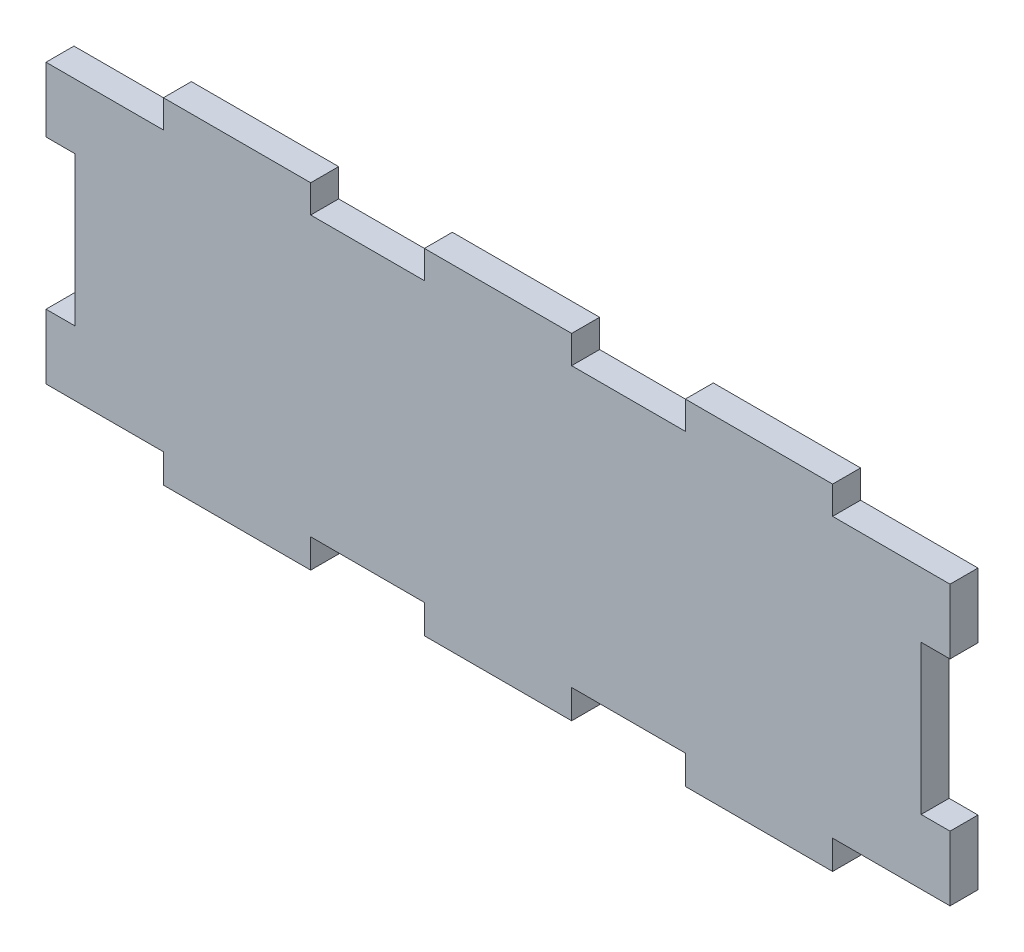
ISO-10303-21;
HEADER;
FILE_DESCRIPTION(('STEP AP214'),'2;1');
FILE_NAME('part.step','',(''),(''),'','','');
FILE_SCHEMA(('AUTOMOTIVE_DESIGN { 1 0 10303 214 1 1 1 1 }'));
ENDSEC;
DATA;
#1=APPLICATION_CONTEXT('core data for automotive mechanical design processes');
#2=APPLICATION_PROTOCOL_DEFINITION('international standard','automotive_design',2000,#1);
#3=PRODUCT_CONTEXT('',#1,'mechanical');
#4=PRODUCT('Part','Part','',(#3));
#5=PRODUCT_RELATED_PRODUCT_CATEGORY('part','',(#4));
#6=PRODUCT_DEFINITION_FORMATION('','',#4);
#7=PRODUCT_DEFINITION_CONTEXT('part definition',#1,'design');
#8=PRODUCT_DEFINITION('design','',#6,#7);
#9=PRODUCT_DEFINITION_SHAPE('','',#8);
#10=(LENGTH_UNIT() NAMED_UNIT(*) SI_UNIT(.MILLI.,.METRE.));
#11=(NAMED_UNIT(*) PLANE_ANGLE_UNIT() SI_UNIT($,.RADIAN.));
#12=(NAMED_UNIT(*) SI_UNIT($,.STERADIAN.) SOLID_ANGLE_UNIT());
#13=UNCERTAINTY_MEASURE_WITH_UNIT(LENGTH_MEASURE(1.E-05),#10,'distance_accuracy_value','');
#14=(GEOMETRIC_REPRESENTATION_CONTEXT(3) GLOBAL_UNCERTAINTY_ASSIGNED_CONTEXT((#13)) GLOBAL_UNIT_ASSIGNED_CONTEXT((#10,
#11,#12)) REPRESENTATION_CONTEXT('',''));
#15=CARTESIAN_POINT('',(0.,0.,0.));
#16=DIRECTION('',(0.,0.,1.));
#17=DIRECTION('',(1.,0.,0.));
#18=AXIS2_PLACEMENT_3D('',#15,#16,#17);
#19=CARTESIAN_POINT('',(0.,22.95,3.));
#20=DIRECTION('',(0.,-1.,0.));
#21=DIRECTION('',(0.,0.,-1.));
#22=AXIS2_PLACEMENT_3D('',#19,#20,#21);
#23=PLANE('',#22);
#24=DIRECTION('',(-1.,0.,0.));
#25=VECTOR('',#24,1.);
#26=CARTESIAN_POINT('',(0.,22.95,0.));
#27=LINE('',#26,#25);
#28=CARTESIAN_POINT('',(97.,22.95,0.));
#29=VERTEX_POINT('',#28);
#30=CARTESIAN_POINT('',(93.9,22.95,0.));
#31=VERTEX_POINT('',#30);
#32=EDGE_CURVE('E296',#29,#31,#27,.T.);
#33=ORIENTED_EDGE('',*,*,#32,.F.);
#34=DIRECTION('',(0.,0.,-1.));
#35=VECTOR('',#34,1.);
#36=CARTESIAN_POINT('',(97.,22.95,3.));
#37=LINE('',#36,#35);
#38=CARTESIAN_POINT('',(97.,22.95,3.));
#39=VERTEX_POINT('',#38);
#40=EDGE_CURVE('E11',#39,#29,#37,.T.);
#41=ORIENTED_EDGE('',*,*,#40,.F.);
#42=DIRECTION('',(-1.,0.,0.));
#43=VECTOR('',#42,1.);
#44=CARTESIAN_POINT('',(0.,22.95,3.));
#45=LINE('',#44,#43);
#46=CARTESIAN_POINT('',(93.9,22.95,3.));
#47=VERTEX_POINT('',#46);
#48=EDGE_CURVE('E385',#39,#47,#45,.T.);
#49=ORIENTED_EDGE('',*,*,#48,.T.);
#50=DIRECTION('',(0.,0.,-1.));
#51=VECTOR('',#50,1.);
#52=CARTESIAN_POINT('',(93.9,22.95,3.));
#53=LINE('',#52,#51);
#54=EDGE_CURVE('E50',#47,#31,#53,.T.);
#55=ORIENTED_EDGE('',*,*,#54,.T.);
#56=EDGE_LOOP('',(#33,#41,#49,#55));
#57=FACE_BOUND('',#56,.T.);
#58=ADVANCED_FACE('F34',(#57),#23,.T.);
#59=CARTESIAN_POINT('',(97.,0.,3.));
#60=DIRECTION('',(-1.,0.,0.));
#61=DIRECTION('',(0.,0.,1.));
#62=AXIS2_PLACEMENT_3D('',#59,#60,#61);
#63=PLANE('',#62);
#64=DIRECTION('',(0.,1.,0.));
#65=VECTOR('',#64,1.);
#66=CARTESIAN_POINT('',(97.,0.,0.));
#67=LINE('',#66,#65);
#68=CARTESIAN_POINT('',(97.,29.9,0.));
#69=VERTEX_POINT('',#68);
#70=EDGE_CURVE('E298',#29,#69,#67,.T.);
#71=ORIENTED_EDGE('',*,*,#70,.T.);
#72=DIRECTION('',(0.,0.,-1.));
#73=VECTOR('',#72,1.);
#74=CARTESIAN_POINT('',(97.,29.9,3.));
#75=LINE('',#74,#73);
#76=CARTESIAN_POINT('',(97.,29.9,3.));
#77=VERTEX_POINT('',#76);
#78=EDGE_CURVE('E42',#77,#69,#75,.T.);
#79=ORIENTED_EDGE('',*,*,#78,.F.);
#80=DIRECTION('',(0.,1.,0.));
#81=VECTOR('',#80,1.);
#82=CARTESIAN_POINT('',(97.,0.,3.));
#83=LINE('',#82,#81);
#84=EDGE_CURVE('E483',#39,#77,#83,.T.);
#85=ORIENTED_EDGE('',*,*,#84,.F.);
#86=ORIENTED_EDGE('',*,*,#40,.T.);
#87=EDGE_LOOP('',(#71,#79,#85,#86));
#88=FACE_BOUND('',#87,.T.);
#89=ADVANCED_FACE('F471',(#88),#63,.F.);
#90=CARTESIAN_POINT('',(0.,29.9,3.));
#91=DIRECTION('',(0.,1.,0.));
#92=DIRECTION('',(0.,0.,1.));
#93=AXIS2_PLACEMENT_3D('',#90,#91,#92);
#94=PLANE('',#93);
#95=DIRECTION('',(1.,0.,0.));
#96=VECTOR('',#95,1.);
#97=CARTESIAN_POINT('',(0.,29.9,0.));
#98=LINE('',#97,#96);
#99=CARTESIAN_POINT('',(84.4,29.9,0.));
#100=VERTEX_POINT('',#99);
#101=EDGE_CURVE('E301',#100,#69,#98,.T.);
#102=ORIENTED_EDGE('',*,*,#101,.F.);
#103=DIRECTION('',(0.,0.,-1.));
#104=VECTOR('',#103,1.);
#105=CARTESIAN_POINT('',(84.4,29.9,3.));
#106=LINE('',#105,#104);
#107=CARTESIAN_POINT('',(84.4,29.9,3.));
#108=VERTEX_POINT('',#107);
#109=EDGE_CURVE('E461',#108,#100,#106,.T.);
#110=ORIENTED_EDGE('',*,*,#109,.F.);
#111=DIRECTION('',(1.,0.,0.));
#112=VECTOR('',#111,1.);
#113=CARTESIAN_POINT('',(0.,29.9,3.));
#114=LINE('',#113,#112);
#115=EDGE_CURVE('E468',#108,#77,#114,.T.);
#116=ORIENTED_EDGE('',*,*,#115,.T.);
#117=ORIENTED_EDGE('',*,*,#78,.T.);
#118=EDGE_LOOP('',(#102,#110,#116,#117));
#119=FACE_BOUND('',#118,.T.);
#120=ADVANCED_FACE('F466',(#119),#94,.T.);
#121=CARTESIAN_POINT('',(84.4,0.,3.));
#122=DIRECTION('',(1.,0.,0.));
#123=DIRECTION('',(0.,0.,-1.));
#124=AXIS2_PLACEMENT_3D('',#121,#122,#123);
#125=PLANE('',#124);
#126=DIRECTION('',(0.,-1.,0.));
#127=VECTOR('',#126,1.);
#128=CARTESIAN_POINT('',(84.4,0.,0.));
#129=LINE('',#128,#127);
#130=CARTESIAN_POINT('',(84.4,32.9,0.));
#131=VERTEX_POINT('',#130);
#132=EDGE_CURVE('E304',#131,#100,#129,.T.);
#133=ORIENTED_EDGE('',*,*,#132,.F.);
#134=DIRECTION('',(0.,0.,-1.));
#135=VECTOR('',#134,1.);
#136=CARTESIAN_POINT('',(84.4,32.9,3.));
#137=LINE('',#136,#135);
#138=CARTESIAN_POINT('',(84.4,32.9,3.));
#139=VERTEX_POINT('',#138);
#140=EDGE_CURVE('E459',#139,#131,#137,.T.);
#141=ORIENTED_EDGE('',*,*,#140,.F.);
#142=DIRECTION('',(0.,-1.,0.));
#143=VECTOR('',#142,1.);
#144=CARTESIAN_POINT('',(84.4,0.,3.));
#145=LINE('',#144,#143);
#146=EDGE_CURVE('E480',#139,#108,#145,.T.);
#147=ORIENTED_EDGE('',*,*,#146,.T.);
#148=ORIENTED_EDGE('',*,*,#109,.T.);
#149=EDGE_LOOP('',(#133,#141,#147,#148));
#150=FACE_BOUND('',#149,.T.);
#151=ADVANCED_FACE('F477',(#150),#125,.T.);
#152=CARTESIAN_POINT('',(0.,32.9,3.));
#153=DIRECTION('',(0.,1.,0.));
#154=DIRECTION('',(0.,0.,1.));
#155=AXIS2_PLACEMENT_3D('',#152,#153,#154);
#156=PLANE('',#155);
#157=DIRECTION('',(1.,0.,0.));
#158=VECTOR('',#157,1.);
#159=CARTESIAN_POINT('',(0.,32.9,0.));
#160=LINE('',#159,#158);
#161=CARTESIAN_POINT('',(68.6,32.9,0.));
#162=VERTEX_POINT('',#161);
#163=EDGE_CURVE('E307',#162,#131,#160,.T.);
#164=ORIENTED_EDGE('',*,*,#163,.F.);
#165=DIRECTION('',(0.,0.,-1.));
#166=VECTOR('',#165,1.);
#167=CARTESIAN_POINT('',(68.6,32.9,3.));
#168=LINE('',#167,#166);
#169=CARTESIAN_POINT('',(68.6,32.9,3.));
#170=VERTEX_POINT('',#169);
#171=EDGE_CURVE('E457',#170,#162,#168,.T.);
#172=ORIENTED_EDGE('',*,*,#171,.F.);
#173=DIRECTION('',(1.,0.,0.));
#174=VECTOR('',#173,1.);
#175=CARTESIAN_POINT('',(0.,32.9,3.));
#176=LINE('',#175,#174);
#177=EDGE_CURVE('E485',#170,#139,#176,.T.);
#178=ORIENTED_EDGE('',*,*,#177,.T.);
#179=ORIENTED_EDGE('',*,*,#140,.T.);
#180=EDGE_LOOP('',(#164,#172,#178,#179));
#181=FACE_BOUND('',#180,.T.);
#182=ADVANCED_FACE('F587',(#181),#156,.T.);
#183=CARTESIAN_POINT('',(68.6,0.,3.));
#184=DIRECTION('',(-1.,0.,0.));
#185=DIRECTION('',(0.,0.,1.));
#186=AXIS2_PLACEMENT_3D('',#183,#184,#185);
#187=PLANE('',#186);
#188=DIRECTION('',(0.,1.,0.));
#189=VECTOR('',#188,1.);
#190=CARTESIAN_POINT('',(68.6,0.,0.));
#191=LINE('',#190,#189);
#192=CARTESIAN_POINT('',(68.6,29.9,0.));
#193=VERTEX_POINT('',#192);
#194=EDGE_CURVE('E310',#193,#162,#191,.T.);
#195=ORIENTED_EDGE('',*,*,#194,.F.);
#196=DIRECTION('',(0.,0.,-1.));
#197=VECTOR('',#196,1.);
#198=CARTESIAN_POINT('',(68.6,29.9,3.));
#199=LINE('',#198,#197);
#200=CARTESIAN_POINT('',(68.6,29.9,3.));
#201=VERTEX_POINT('',#200);
#202=EDGE_CURVE('E455',#201,#193,#199,.T.);
#203=ORIENTED_EDGE('',*,*,#202,.F.);
#204=DIRECTION('',(0.,1.,0.));
#205=VECTOR('',#204,1.);
#206=CARTESIAN_POINT('',(68.6,0.,3.));
#207=LINE('',#206,#205);
#208=EDGE_CURVE('E491',#201,#170,#207,.T.);
#209=ORIENTED_EDGE('',*,*,#208,.T.);
#210=ORIENTED_EDGE('',*,*,#171,.T.);
#211=EDGE_LOOP('',(#195,#203,#209,#210));
#212=FACE_BOUND('',#211,.T.);
#213=ADVANCED_FACE('F590',(#212),#187,.T.);
#214=CARTESIAN_POINT('',(0.,29.9,3.));
#215=DIRECTION('',(0.,1.,0.));
#216=DIRECTION('',(0.,0.,1.));
#217=AXIS2_PLACEMENT_3D('',#214,#215,#216);
#218=PLANE('',#217);
#219=DIRECTION('',(1.,0.,0.));
#220=VECTOR('',#219,1.);
#221=CARTESIAN_POINT('',(0.,29.9,0.));
#222=LINE('',#221,#220);
#223=CARTESIAN_POINT('',(56.4,29.9,0.));
#224=VERTEX_POINT('',#223);
#225=EDGE_CURVE('E313',#224,#193,#222,.T.);
#226=ORIENTED_EDGE('',*,*,#225,.F.);
#227=DIRECTION('',(0.,0.,-1.));
#228=VECTOR('',#227,1.);
#229=CARTESIAN_POINT('',(56.4,29.9,3.));
#230=LINE('',#229,#228);
#231=CARTESIAN_POINT('',(56.4,29.9,3.));
#232=VERTEX_POINT('',#231);
#233=EDGE_CURVE('E453',#232,#224,#230,.T.);
#234=ORIENTED_EDGE('',*,*,#233,.F.);
#235=DIRECTION('',(1.,0.,0.));
#236=VECTOR('',#235,1.);
#237=CARTESIAN_POINT('',(0.,29.9,3.));
#238=LINE('',#237,#236);
#239=EDGE_CURVE('E494',#232,#201,#238,.T.);
#240=ORIENTED_EDGE('',*,*,#239,.T.);
#241=ORIENTED_EDGE('',*,*,#202,.T.);
#242=EDGE_LOOP('',(#226,#234,#240,#241));
#243=FACE_BOUND('',#242,.T.);
#244=ADVANCED_FACE('F594',(#243),#218,.T.);
#245=CARTESIAN_POINT('',(56.4,0.,3.));
#246=DIRECTION('',(1.,0.,0.));
#247=DIRECTION('',(0.,0.,-1.));
#248=AXIS2_PLACEMENT_3D('',#245,#246,#247);
#249=PLANE('',#248);
#250=DIRECTION('',(0.,-1.,0.));
#251=VECTOR('',#250,1.);
#252=CARTESIAN_POINT('',(56.4,0.,0.));
#253=LINE('',#252,#251);
#254=CARTESIAN_POINT('',(56.4,32.9,0.));
#255=VERTEX_POINT('',#254);
#256=EDGE_CURVE('E316',#255,#224,#253,.T.);
#257=ORIENTED_EDGE('',*,*,#256,.F.);
#258=DIRECTION('',(0.,0.,-1.));
#259=VECTOR('',#258,1.);
#260=CARTESIAN_POINT('',(56.4,32.9,3.));
#261=LINE('',#260,#259);
#262=CARTESIAN_POINT('',(56.4,32.9,3.));
#263=VERTEX_POINT('',#262);
#264=EDGE_CURVE('E451',#263,#255,#261,.T.);
#265=ORIENTED_EDGE('',*,*,#264,.F.);
#266=DIRECTION('',(0.,-1.,0.));
#267=VECTOR('',#266,1.);
#268=CARTESIAN_POINT('',(56.4,0.,3.));
#269=LINE('',#268,#267);
#270=EDGE_CURVE('E497',#263,#232,#269,.T.);
#271=ORIENTED_EDGE('',*,*,#270,.T.);
#272=ORIENTED_EDGE('',*,*,#233,.T.);
#273=EDGE_LOOP('',(#257,#265,#271,#272));
#274=FACE_BOUND('',#273,.T.);
#275=ADVANCED_FACE('F598',(#274),#249,.T.);
#276=CARTESIAN_POINT('',(0.,32.9,3.));
#277=DIRECTION('',(0.,1.,0.));
#278=DIRECTION('',(0.,0.,1.));
#279=AXIS2_PLACEMENT_3D('',#276,#277,#278);
#280=PLANE('',#279);
#281=DIRECTION('',(1.,0.,0.));
#282=VECTOR('',#281,1.);
#283=CARTESIAN_POINT('',(0.,32.9,0.));
#284=LINE('',#283,#282);
#285=CARTESIAN_POINT('',(40.6,32.9,0.));
#286=VERTEX_POINT('',#285);
#287=EDGE_CURVE('E319',#286,#255,#284,.T.);
#288=ORIENTED_EDGE('',*,*,#287,.F.);
#289=DIRECTION('',(0.,0.,-1.));
#290=VECTOR('',#289,1.);
#291=CARTESIAN_POINT('',(40.6,32.9,3.));
#292=LINE('',#291,#290);
#293=CARTESIAN_POINT('',(40.6,32.9,3.));
#294=VERTEX_POINT('',#293);
#295=EDGE_CURVE('E449',#294,#286,#292,.T.);
#296=ORIENTED_EDGE('',*,*,#295,.F.);
#297=DIRECTION('',(1.,0.,0.));
#298=VECTOR('',#297,1.);
#299=CARTESIAN_POINT('',(0.,32.9,3.));
#300=LINE('',#299,#298);
#301=EDGE_CURVE('E500',#294,#263,#300,.T.);
#302=ORIENTED_EDGE('',*,*,#301,.T.);
#303=ORIENTED_EDGE('',*,*,#264,.T.);
#304=EDGE_LOOP('',(#288,#296,#302,#303));
#305=FACE_BOUND('',#304,.T.);
#306=ADVANCED_FACE('F602',(#305),#280,.T.);
#307=CARTESIAN_POINT('',(40.6,0.,3.));
#308=DIRECTION('',(-1.,0.,0.));
#309=DIRECTION('',(0.,0.,1.));
#310=AXIS2_PLACEMENT_3D('',#307,#308,#309);
#311=PLANE('',#310);
#312=DIRECTION('',(0.,1.,0.));
#313=VECTOR('',#312,1.);
#314=CARTESIAN_POINT('',(40.6,0.,0.));
#315=LINE('',#314,#313);
#316=CARTESIAN_POINT('',(40.6,29.9,0.));
#317=VERTEX_POINT('',#316);
#318=EDGE_CURVE('E322',#317,#286,#315,.T.);
#319=ORIENTED_EDGE('',*,*,#318,.F.);
#320=DIRECTION('',(0.,0.,-1.));
#321=VECTOR('',#320,1.);
#322=CARTESIAN_POINT('',(40.6,29.9,3.));
#323=LINE('',#322,#321);
#324=CARTESIAN_POINT('',(40.6,29.9,3.));
#325=VERTEX_POINT('',#324);
#326=EDGE_CURVE('E447',#325,#317,#323,.T.);
#327=ORIENTED_EDGE('',*,*,#326,.F.);
#328=DIRECTION('',(0.,1.,0.));
#329=VECTOR('',#328,1.);
#330=CARTESIAN_POINT('',(40.6,0.,3.));
#331=LINE('',#330,#329);
#332=EDGE_CURVE('E503',#325,#294,#331,.T.);
#333=ORIENTED_EDGE('',*,*,#332,.T.);
#334=ORIENTED_EDGE('',*,*,#295,.T.);
#335=EDGE_LOOP('',(#319,#327,#333,#334));
#336=FACE_BOUND('',#335,.T.);
#337=ADVANCED_FACE('F606',(#336),#311,.T.);
#338=CARTESIAN_POINT('',(0.,29.9,3.));
#339=DIRECTION('',(0.,1.,0.));
#340=DIRECTION('',(0.,0.,1.));
#341=AXIS2_PLACEMENT_3D('',#338,#339,#340);
#342=PLANE('',#341);
#343=DIRECTION('',(1.,0.,0.));
#344=VECTOR('',#343,1.);
#345=CARTESIAN_POINT('',(0.,29.9,0.));
#346=LINE('',#345,#344);
#347=CARTESIAN_POINT('',(28.4,29.9,0.));
#348=VERTEX_POINT('',#347);
#349=EDGE_CURVE('E325',#348,#317,#346,.T.);
#350=ORIENTED_EDGE('',*,*,#349,.F.);
#351=DIRECTION('',(0.,0.,-1.));
#352=VECTOR('',#351,1.);
#353=CARTESIAN_POINT('',(28.4,29.9,3.));
#354=LINE('',#353,#352);
#355=CARTESIAN_POINT('',(28.4,29.9,3.));
#356=VERTEX_POINT('',#355);
#357=EDGE_CURVE('E445',#356,#348,#354,.T.);
#358=ORIENTED_EDGE('',*,*,#357,.F.);
#359=DIRECTION('',(1.,0.,0.));
#360=VECTOR('',#359,1.);
#361=CARTESIAN_POINT('',(0.,29.9,3.));
#362=LINE('',#361,#360);
#363=EDGE_CURVE('E506',#356,#325,#362,.T.);
#364=ORIENTED_EDGE('',*,*,#363,.T.);
#365=ORIENTED_EDGE('',*,*,#326,.T.);
#366=EDGE_LOOP('',(#350,#358,#364,#365));
#367=FACE_BOUND('',#366,.T.);
#368=ADVANCED_FACE('F610',(#367),#342,.T.);
#369=CARTESIAN_POINT('',(28.4,0.,3.));
#370=DIRECTION('',(1.,0.,0.));
#371=DIRECTION('',(0.,0.,-1.));
#372=AXIS2_PLACEMENT_3D('',#369,#370,#371);
#373=PLANE('',#372);
#374=DIRECTION('',(0.,-1.,0.));
#375=VECTOR('',#374,1.);
#376=CARTESIAN_POINT('',(28.4,0.,0.));
#377=LINE('',#376,#375);
#378=CARTESIAN_POINT('',(28.4,32.9,0.));
#379=VERTEX_POINT('',#378);
#380=EDGE_CURVE('E328',#379,#348,#377,.T.);
#381=ORIENTED_EDGE('',*,*,#380,.F.);
#382=DIRECTION('',(0.,0.,-1.));
#383=VECTOR('',#382,1.);
#384=CARTESIAN_POINT('',(28.4,32.9,3.));
#385=LINE('',#384,#383);
#386=CARTESIAN_POINT('',(28.4,32.9,3.));
#387=VERTEX_POINT('',#386);
#388=EDGE_CURVE('E443',#387,#379,#385,.T.);
#389=ORIENTED_EDGE('',*,*,#388,.F.);
#390=DIRECTION('',(0.,-1.,0.));
#391=VECTOR('',#390,1.);
#392=CARTESIAN_POINT('',(28.4,0.,3.));
#393=LINE('',#392,#391);
#394=EDGE_CURVE('E509',#387,#356,#393,.T.);
#395=ORIENTED_EDGE('',*,*,#394,.T.);
#396=ORIENTED_EDGE('',*,*,#357,.T.);
#397=EDGE_LOOP('',(#381,#389,#395,#396));
#398=FACE_BOUND('',#397,.T.);
#399=ADVANCED_FACE('F614',(#398),#373,.T.);
#400=CARTESIAN_POINT('',(0.,32.9,3.));
#401=DIRECTION('',(0.,1.,0.));
#402=DIRECTION('',(0.,0.,1.));
#403=AXIS2_PLACEMENT_3D('',#400,#401,#402);
#404=PLANE('',#403);
#405=DIRECTION('',(1.,0.,0.));
#406=VECTOR('',#405,1.);
#407=CARTESIAN_POINT('',(0.,32.9,0.));
#408=LINE('',#407,#406);
#409=CARTESIAN_POINT('',(12.6,32.9,0.));
#410=VERTEX_POINT('',#409);
#411=EDGE_CURVE('E331',#410,#379,#408,.T.);
#412=ORIENTED_EDGE('',*,*,#411,.F.);
#413=DIRECTION('',(0.,0.,-1.));
#414=VECTOR('',#413,1.);
#415=CARTESIAN_POINT('',(12.6,32.9,3.));
#416=LINE('',#415,#414);
#417=CARTESIAN_POINT('',(12.6,32.9,3.));
#418=VERTEX_POINT('',#417);
#419=EDGE_CURVE('E441',#418,#410,#416,.T.);
#420=ORIENTED_EDGE('',*,*,#419,.F.);
#421=DIRECTION('',(1.,0.,0.));
#422=VECTOR('',#421,1.);
#423=CARTESIAN_POINT('',(0.,32.9,3.));
#424=LINE('',#423,#422);
#425=EDGE_CURVE('E512',#418,#387,#424,.T.);
#426=ORIENTED_EDGE('',*,*,#425,.T.);
#427=ORIENTED_EDGE('',*,*,#388,.T.);
#428=EDGE_LOOP('',(#412,#420,#426,#427));
#429=FACE_BOUND('',#428,.T.);
#430=ADVANCED_FACE('F618',(#429),#404,.T.);
#431=CARTESIAN_POINT('',(12.6,0.,3.));
#432=DIRECTION('',(-1.,0.,0.));
#433=DIRECTION('',(0.,0.,1.));
#434=AXIS2_PLACEMENT_3D('',#431,#432,#433);
#435=PLANE('',#434);
#436=DIRECTION('',(0.,1.,0.));
#437=VECTOR('',#436,1.);
#438=CARTESIAN_POINT('',(12.6,0.,0.));
#439=LINE('',#438,#437);
#440=CARTESIAN_POINT('',(12.6,29.9,0.));
#441=VERTEX_POINT('',#440);
#442=EDGE_CURVE('E334',#441,#410,#439,.T.);
#443=ORIENTED_EDGE('',*,*,#442,.F.);
#444=DIRECTION('',(0.,0.,-1.));
#445=VECTOR('',#444,1.);
#446=CARTESIAN_POINT('',(12.6,29.9,3.));
#447=LINE('',#446,#445);
#448=CARTESIAN_POINT('',(12.6,29.9,3.));
#449=VERTEX_POINT('',#448);
#450=EDGE_CURVE('E439',#449,#441,#447,.T.);
#451=ORIENTED_EDGE('',*,*,#450,.F.);
#452=DIRECTION('',(0.,1.,0.));
#453=VECTOR('',#452,1.);
#454=CARTESIAN_POINT('',(12.6,0.,3.));
#455=LINE('',#454,#453);
#456=EDGE_CURVE('E515',#449,#418,#455,.T.);
#457=ORIENTED_EDGE('',*,*,#456,.T.);
#458=ORIENTED_EDGE('',*,*,#419,.T.);
#459=EDGE_LOOP('',(#443,#451,#457,#458));
#460=FACE_BOUND('',#459,.T.);
#461=ADVANCED_FACE('F622',(#460),#435,.T.);
#462=CARTESIAN_POINT('',(0.,29.9,3.));
#463=DIRECTION('',(0.,1.,0.));
#464=DIRECTION('',(0.,0.,1.));
#465=AXIS2_PLACEMENT_3D('',#462,#463,#464);
#466=PLANE('',#465);
#467=DIRECTION('',(1.,0.,0.));
#468=VECTOR('',#467,1.);
#469=CARTESIAN_POINT('',(0.,29.9,0.));
#470=LINE('',#469,#468);
#471=CARTESIAN_POINT('',(0.,29.9,0.));
#472=VERTEX_POINT('',#471);
#473=EDGE_CURVE('E337',#472,#441,#470,.T.);
#474=ORIENTED_EDGE('',*,*,#473,.F.);
#475=DIRECTION('',(0.,0.,-1.));
#476=VECTOR('',#475,1.);
#477=CARTESIAN_POINT('',(0.,29.9,3.));
#478=LINE('',#477,#476);
#479=CARTESIAN_POINT('',(0.,29.9,3.));
#480=VERTEX_POINT('',#479);
#481=EDGE_CURVE('E437',#480,#472,#478,.T.);
#482=ORIENTED_EDGE('',*,*,#481,.F.);
#483=DIRECTION('',(1.,0.,0.));
#484=VECTOR('',#483,1.);
#485=CARTESIAN_POINT('',(0.,29.9,3.));
#486=LINE('',#485,#484);
#487=EDGE_CURVE('E518',#480,#449,#486,.T.);
#488=ORIENTED_EDGE('',*,*,#487,.T.);
#489=ORIENTED_EDGE('',*,*,#450,.T.);
#490=EDGE_LOOP('',(#474,#482,#488,#489));
#491=FACE_BOUND('',#490,.T.);
#492=ADVANCED_FACE('F626',(#491),#466,.T.);
#493=CARTESIAN_POINT('',(0.,0.,3.));
#494=DIRECTION('',(-1.,0.,0.));
#495=DIRECTION('',(0.,0.,1.));
#496=AXIS2_PLACEMENT_3D('',#493,#494,#495);
#497=PLANE('',#496);
#498=DIRECTION('',(0.,1.,0.));
#499=VECTOR('',#498,1.);
#500=CARTESIAN_POINT('',(0.,0.,0.));
#501=LINE('',#500,#499);
#502=CARTESIAN_POINT('',(0.,22.95,0.));
#503=VERTEX_POINT('',#502);
#504=EDGE_CURVE('E340',#503,#472,#501,.T.);
#505=ORIENTED_EDGE('',*,*,#504,.F.);
#506=DIRECTION('',(0.,0.,-1.));
#507=VECTOR('',#506,1.);
#508=CARTESIAN_POINT('',(0.,22.95,3.));
#509=LINE('',#508,#507);
#510=CARTESIAN_POINT('',(0.,22.95,3.));
#511=VERTEX_POINT('',#510);
#512=EDGE_CURVE('E435',#511,#503,#509,.T.);
#513=ORIENTED_EDGE('',*,*,#512,.F.);
#514=DIRECTION('',(0.,1.,0.));
#515=VECTOR('',#514,1.);
#516=CARTESIAN_POINT('',(0.,0.,3.));
#517=LINE('',#516,#515);
#518=EDGE_CURVE('E521',#511,#480,#517,.T.);
#519=ORIENTED_EDGE('',*,*,#518,.T.);
#520=ORIENTED_EDGE('',*,*,#481,.T.);
#521=EDGE_LOOP('',(#505,#513,#519,#520));
#522=FACE_BOUND('',#521,.T.);
#523=ADVANCED_FACE('F630',(#522),#497,.T.);
#524=CARTESIAN_POINT('',(0.,22.95,3.));
#525=DIRECTION('',(0.,1.,0.));
#526=DIRECTION('',(0.,0.,1.));
#527=AXIS2_PLACEMENT_3D('',#524,#525,#526);
#528=PLANE('',#527);
#529=DIRECTION('',(1.,0.,0.));
#530=VECTOR('',#529,1.);
#531=CARTESIAN_POINT('',(0.,22.95,0.));
#532=LINE('',#531,#530);
#533=CARTESIAN_POINT('',(3.1,22.95,0.));
#534=VERTEX_POINT('',#533);
#535=EDGE_CURVE('E343',#503,#534,#532,.T.);
#536=ORIENTED_EDGE('',*,*,#535,.T.);
#537=DIRECTION('',(0.,0.,-1.));
#538=VECTOR('',#537,1.);
#539=CARTESIAN_POINT('',(3.1,22.95,3.));
#540=LINE('',#539,#538);
#541=CARTESIAN_POINT('',(3.1,22.95,3.));
#542=VERTEX_POINT('',#541);
#543=EDGE_CURVE('E432',#542,#534,#540,.T.);
#544=ORIENTED_EDGE('',*,*,#543,.F.);
#545=DIRECTION('',(1.,0.,0.));
#546=VECTOR('',#545,1.);
#547=CARTESIAN_POINT('',(0.,22.95,3.));
#548=LINE('',#547,#546);
#549=EDGE_CURVE('E524',#511,#542,#548,.T.);
#550=ORIENTED_EDGE('',*,*,#549,.F.);
#551=ORIENTED_EDGE('',*,*,#512,.T.);
#552=EDGE_LOOP('',(#536,#544,#550,#551));
#553=FACE_BOUND('',#552,.T.);
#554=ADVANCED_FACE('F634',(#553),#528,.F.);
#555=CARTESIAN_POINT('',(3.1,0.,3.));
#556=DIRECTION('',(1.,0.,0.));
#557=DIRECTION('',(0.,0.,-1.));
#558=AXIS2_PLACEMENT_3D('',#555,#556,#557);
#559=PLANE('',#558);
#560=DIRECTION('',(0.,-1.,0.));
#561=VECTOR('',#560,1.);
#562=CARTESIAN_POINT('',(3.1,0.,0.));
#563=LINE('',#562,#561);
#564=CARTESIAN_POINT('',(3.1,6.95,0.));
#565=VERTEX_POINT('',#564);
#566=EDGE_CURVE('E345',#534,#565,#563,.T.);
#567=ORIENTED_EDGE('',*,*,#566,.T.);
#568=DIRECTION('',(0.,0.,-1.));
#569=VECTOR('',#568,1.);
#570=CARTESIAN_POINT('',(3.1,6.95,3.));
#571=LINE('',#570,#569);
#572=CARTESIAN_POINT('',(3.1,6.95,3.));
#573=VERTEX_POINT('',#572);
#574=EDGE_CURVE('E429',#573,#565,#571,.T.);
#575=ORIENTED_EDGE('',*,*,#574,.F.);
#576=DIRECTION('',(0.,-1.,0.));
#577=VECTOR('',#576,1.);
#578=CARTESIAN_POINT('',(3.1,0.,3.));
#579=LINE('',#578,#577);
#580=EDGE_CURVE('E526',#542,#573,#579,.T.);
#581=ORIENTED_EDGE('',*,*,#580,.F.);
#582=ORIENTED_EDGE('',*,*,#543,.T.);
#583=EDGE_LOOP('',(#567,#575,#581,#582));
#584=FACE_BOUND('',#583,.T.);
#585=ADVANCED_FACE('F638',(#584),#559,.F.);
#586=CARTESIAN_POINT('',(0.,6.95,3.));
#587=DIRECTION('',(0.,-1.,0.));
#588=DIRECTION('',(0.,0.,-1.));
#589=AXIS2_PLACEMENT_3D('',#586,#587,#588);
#590=PLANE('',#589);
#591=DIRECTION('',(-1.,0.,0.));
#592=VECTOR('',#591,1.);
#593=CARTESIAN_POINT('',(0.,6.95,0.));
#594=LINE('',#593,#592);
#595=CARTESIAN_POINT('',(0.,6.95,0.));
#596=VERTEX_POINT('',#595);
#597=EDGE_CURVE('E347',#565,#596,#594,.T.);
#598=ORIENTED_EDGE('',*,*,#597,.T.);
#599=DIRECTION('',(0.,0.,-1.));
#600=VECTOR('',#599,1.);
#601=CARTESIAN_POINT('',(0.,6.95,3.));
#602=LINE('',#601,#600);
#603=CARTESIAN_POINT('',(0.,6.95,3.));
#604=VERTEX_POINT('',#603);
#605=EDGE_CURVE('E427',#604,#596,#602,.T.);
#606=ORIENTED_EDGE('',*,*,#605,.F.);
#607=DIRECTION('',(-1.,0.,0.));
#608=VECTOR('',#607,1.);
#609=CARTESIAN_POINT('',(0.,6.95,3.));
#610=LINE('',#609,#608);
#611=EDGE_CURVE('E528',#573,#604,#610,.T.);
#612=ORIENTED_EDGE('',*,*,#611,.F.);
#613=ORIENTED_EDGE('',*,*,#574,.T.);
#614=EDGE_LOOP('',(#598,#606,#612,#613));
#615=FACE_BOUND('',#614,.T.);
#616=ADVANCED_FACE('F642',(#615),#590,.F.);
#617=CARTESIAN_POINT('',(0.,0.,3.));
#618=DIRECTION('',(-1.,0.,0.));
#619=DIRECTION('',(0.,0.,1.));
#620=AXIS2_PLACEMENT_3D('',#617,#618,#619);
#621=PLANE('',#620);
#622=DIRECTION('',(0.,1.,0.));
#623=VECTOR('',#622,1.);
#624=CARTESIAN_POINT('',(0.,0.,0.));
#625=LINE('',#624,#623);
#626=CARTESIAN_POINT('',(0.,0.,0.));
#627=VERTEX_POINT('',#626);
#628=EDGE_CURVE('E350',#627,#596,#625,.T.);
#629=ORIENTED_EDGE('',*,*,#628,.F.);
#630=DIRECTION('',(0.,0.,-1.));
#631=VECTOR('',#630,1.);
#632=CARTESIAN_POINT('',(0.,0.,3.));
#633=LINE('',#632,#631);
#634=CARTESIAN_POINT('',(0.,0.,3.));
#635=VERTEX_POINT('',#634);
#636=EDGE_CURVE('E425',#635,#627,#633,.T.);
#637=ORIENTED_EDGE('',*,*,#636,.F.);
#638=DIRECTION('',(0.,1.,0.));
#639=VECTOR('',#638,1.);
#640=CARTESIAN_POINT('',(0.,0.,3.));
#641=LINE('',#640,#639);
#642=EDGE_CURVE('E530',#635,#604,#641,.T.);
#643=ORIENTED_EDGE('',*,*,#642,.T.);
#644=ORIENTED_EDGE('',*,*,#605,.T.);
#645=EDGE_LOOP('',(#629,#637,#643,#644));
#646=FACE_BOUND('',#645,.T.);
#647=ADVANCED_FACE('F646',(#646),#621,.T.);
#648=CARTESIAN_POINT('',(0.,0.,3.));
#649=DIRECTION('',(0.,1.,0.));
#650=DIRECTION('',(0.,0.,1.));
#651=AXIS2_PLACEMENT_3D('',#648,#649,#650);
#652=PLANE('',#651);
#653=DIRECTION('',(1.,0.,0.));
#654=VECTOR('',#653,1.);
#655=CARTESIAN_POINT('',(0.,0.,0.));
#656=LINE('',#655,#654);
#657=CARTESIAN_POINT('',(12.6,0.,0.));
#658=VERTEX_POINT('',#657);
#659=EDGE_CURVE('E353',#627,#658,#656,.T.);
#660=ORIENTED_EDGE('',*,*,#659,.T.);
#661=DIRECTION('',(0.,0.,-1.));
#662=VECTOR('',#661,1.);
#663=CARTESIAN_POINT('',(12.6,0.,3.));
#664=LINE('',#663,#662);
#665=CARTESIAN_POINT('',(12.6,0.,3.));
#666=VERTEX_POINT('',#665);
#667=EDGE_CURVE('E422',#666,#658,#664,.T.);
#668=ORIENTED_EDGE('',*,*,#667,.F.);
#669=DIRECTION('',(1.,0.,0.));
#670=VECTOR('',#669,1.);
#671=CARTESIAN_POINT('',(0.,0.,3.));
#672=LINE('',#671,#670);
#673=EDGE_CURVE('E533',#635,#666,#672,.T.);
#674=ORIENTED_EDGE('',*,*,#673,.F.);
#675=ORIENTED_EDGE('',*,*,#636,.T.);
#676=EDGE_LOOP('',(#660,#668,#674,#675));
#677=FACE_BOUND('',#676,.T.);
#678=ADVANCED_FACE('F650',(#677),#652,.F.);
#679=CARTESIAN_POINT('',(12.6,0.,3.));
#680=DIRECTION('',(1.,0.,0.));
#681=DIRECTION('',(0.,1.,0.));
#682=AXIS2_PLACEMENT_3D('',#679,#680,#681);
#683=PLANE('',#682);
#684=DIRECTION('',(0.,-1.,0.));
#685=VECTOR('',#684,1.);
#686=CARTESIAN_POINT('',(12.6,0.,0.));
#687=LINE('',#686,#685);
#688=CARTESIAN_POINT('',(12.6,-3.1,0.));
#689=VERTEX_POINT('',#688);
#690=EDGE_CURVE('E355',#658,#689,#687,.T.);
#691=ORIENTED_EDGE('',*,*,#690,.T.);
#692=DIRECTION('',(0.,0.,-1.));
#693=VECTOR('',#692,1.);
#694=CARTESIAN_POINT('',(12.6,-3.1,3.));
#695=LINE('',#694,#693);
#696=CARTESIAN_POINT('',(12.6,-3.1,3.));
#697=VERTEX_POINT('',#696);
#698=EDGE_CURVE('E419',#697,#689,#695,.T.);
#699=ORIENTED_EDGE('',*,*,#698,.F.);
#700=DIRECTION('',(0.,-1.,0.));
#701=VECTOR('',#700,1.);
#702=CARTESIAN_POINT('',(12.6,0.,3.));
#703=LINE('',#702,#701);
#704=EDGE_CURVE('E535',#666,#697,#703,.T.);
#705=ORIENTED_EDGE('',*,*,#704,.F.);
#706=ORIENTED_EDGE('',*,*,#667,.T.);
#707=EDGE_LOOP('',(#691,#699,#705,#706));
#708=FACE_BOUND('',#707,.T.);
#709=ADVANCED_FACE('F654',(#708),#683,.F.);
#710=CARTESIAN_POINT('',(0.,-3.1,3.));
#711=DIRECTION('',(0.,1.,0.));
#712=DIRECTION('',(0.,0.,1.));
#713=AXIS2_PLACEMENT_3D('',#710,#711,#712);
#714=PLANE('',#713);
#715=DIRECTION('',(1.,0.,0.));
#716=VECTOR('',#715,1.);
#717=CARTESIAN_POINT('',(0.,-3.1,0.));
#718=LINE('',#717,#716);
#719=CARTESIAN_POINT('',(28.4,-3.1,0.));
#720=VERTEX_POINT('',#719);
#721=EDGE_CURVE('E357',#689,#720,#718,.T.);
#722=ORIENTED_EDGE('',*,*,#721,.T.);
#723=DIRECTION('',(0.,0.,-1.));
#724=VECTOR('',#723,1.);
#725=CARTESIAN_POINT('',(28.4,-3.1,3.));
#726=LINE('',#725,#724);
#727=CARTESIAN_POINT('',(28.4,-3.1,3.));
#728=VERTEX_POINT('',#727);
#729=EDGE_CURVE('E416',#728,#720,#726,.T.);
#730=ORIENTED_EDGE('',*,*,#729,.F.);
#731=DIRECTION('',(1.,0.,0.));
#732=VECTOR('',#731,1.);
#733=CARTESIAN_POINT('',(0.,-3.1,3.));
#734=LINE('',#733,#732);
#735=EDGE_CURVE('E537',#697,#728,#734,.T.);
#736=ORIENTED_EDGE('',*,*,#735,.F.);
#737=ORIENTED_EDGE('',*,*,#698,.T.);
#738=EDGE_LOOP('',(#722,#730,#736,#737));
#739=FACE_BOUND('',#738,.T.);
#740=ADVANCED_FACE('F658',(#739),#714,.F.);
#741=CARTESIAN_POINT('',(28.4,0.,3.));
#742=DIRECTION('',(-1.,0.,0.));
#743=DIRECTION('',(0.,-1.,0.));
#744=AXIS2_PLACEMENT_3D('',#741,#742,#743);
#745=PLANE('',#744);
#746=DIRECTION('',(0.,1.,0.));
#747=VECTOR('',#746,1.);
#748=CARTESIAN_POINT('',(28.4,0.,0.));
#749=LINE('',#748,#747);
#750=CARTESIAN_POINT('',(28.4,0.,0.));
#751=VERTEX_POINT('',#750);
#752=EDGE_CURVE('E359',#720,#751,#749,.T.);
#753=ORIENTED_EDGE('',*,*,#752,.T.);
#754=DIRECTION('',(0.,0.,-1.));
#755=VECTOR('',#754,1.);
#756=CARTESIAN_POINT('',(28.4,0.,3.));
#757=LINE('',#756,#755);
#758=CARTESIAN_POINT('',(28.4,0.,3.));
#759=VERTEX_POINT('',#758);
#760=EDGE_CURVE('E413',#759,#751,#757,.T.);
#761=ORIENTED_EDGE('',*,*,#760,.F.);
#762=DIRECTION('',(0.,1.,0.));
#763=VECTOR('',#762,1.);
#764=CARTESIAN_POINT('',(28.4,0.,3.));
#765=LINE('',#764,#763);
#766=EDGE_CURVE('E539',#728,#759,#765,.T.);
#767=ORIENTED_EDGE('',*,*,#766,.F.);
#768=ORIENTED_EDGE('',*,*,#729,.T.);
#769=EDGE_LOOP('',(#753,#761,#767,#768));
#770=FACE_BOUND('',#769,.T.);
#771=ADVANCED_FACE('F662',(#770),#745,.F.);
#772=CARTESIAN_POINT('',(0.,0.,3.));
#773=DIRECTION('',(0.,1.,0.));
#774=DIRECTION('',(0.,0.,1.));
#775=AXIS2_PLACEMENT_3D('',#772,#773,#774);
#776=PLANE('',#775);
#777=DIRECTION('',(1.,0.,0.));
#778=VECTOR('',#777,1.);
#779=CARTESIAN_POINT('',(0.,0.,0.));
#780=LINE('',#779,#778);
#781=CARTESIAN_POINT('',(40.6,0.,0.));
#782=VERTEX_POINT('',#781);
#783=EDGE_CURVE('E361',#751,#782,#780,.T.);
#784=ORIENTED_EDGE('',*,*,#783,.T.);
#785=DIRECTION('',(0.,0.,-1.));
#786=VECTOR('',#785,1.);
#787=CARTESIAN_POINT('',(40.6,0.,3.));
#788=LINE('',#787,#786);
#789=CARTESIAN_POINT('',(40.6,0.,3.));
#790=VERTEX_POINT('',#789);
#791=EDGE_CURVE('E410',#790,#782,#788,.T.);
#792=ORIENTED_EDGE('',*,*,#791,.F.);
#793=DIRECTION('',(1.,0.,0.));
#794=VECTOR('',#793,1.);
#795=CARTESIAN_POINT('',(0.,0.,3.));
#796=LINE('',#795,#794);
#797=EDGE_CURVE('E541',#759,#790,#796,.T.);
#798=ORIENTED_EDGE('',*,*,#797,.F.);
#799=ORIENTED_EDGE('',*,*,#760,.T.);
#800=EDGE_LOOP('',(#784,#792,#798,#799));
#801=FACE_BOUND('',#800,.T.);
#802=ADVANCED_FACE('F666',(#801),#776,.F.);
#803=CARTESIAN_POINT('',(40.6,-1.81754253224925E-13,3.));
#804=DIRECTION('',(1.,0.,0.));
#805=DIRECTION('',(0.,1.,0.));
#806=AXIS2_PLACEMENT_3D('',#803,#804,#805);
#807=PLANE('',#806);
#808=DIRECTION('',(0.,-1.,0.));
#809=VECTOR('',#808,1.);
#810=CARTESIAN_POINT('',(40.6,-1.81754253224925E-13,0.));
#811=LINE('',#810,#809);
#812=CARTESIAN_POINT('',(40.6,-3.1,0.));
#813=VERTEX_POINT('',#812);
#814=EDGE_CURVE('E363',#782,#813,#811,.T.);
#815=ORIENTED_EDGE('',*,*,#814,.T.);
#816=DIRECTION('',(0.,0.,-1.));
#817=VECTOR('',#816,1.);
#818=CARTESIAN_POINT('',(40.6,-3.1,3.));
#819=LINE('',#818,#817);
#820=CARTESIAN_POINT('',(40.6,-3.1,3.));
#821=VERTEX_POINT('',#820);
#822=EDGE_CURVE('E407',#821,#813,#819,.T.);
#823=ORIENTED_EDGE('',*,*,#822,.F.);
#824=DIRECTION('',(0.,-1.,0.));
#825=VECTOR('',#824,1.);
#826=CARTESIAN_POINT('',(40.6,-1.81754253224925E-13,3.));
#827=LINE('',#826,#825);
#828=EDGE_CURVE('E543',#790,#821,#827,.T.);
#829=ORIENTED_EDGE('',*,*,#828,.F.);
#830=ORIENTED_EDGE('',*,*,#791,.T.);
#831=EDGE_LOOP('',(#815,#823,#829,#830));
#832=FACE_BOUND('',#831,.T.);
#833=ADVANCED_FACE('F670',(#832),#807,.F.);
#834=CARTESIAN_POINT('',(0.,-3.1,3.));
#835=DIRECTION('',(0.,1.,0.));
#836=DIRECTION('',(0.,0.,1.));
#837=AXIS2_PLACEMENT_3D('',#834,#835,#836);
#838=PLANE('',#837);
#839=DIRECTION('',(1.,0.,0.));
#840=VECTOR('',#839,1.);
#841=CARTESIAN_POINT('',(0.,-3.1,0.));
#842=LINE('',#841,#840);
#843=CARTESIAN_POINT('',(56.4,-3.1,0.));
#844=VERTEX_POINT('',#843);
#845=EDGE_CURVE('E365',#813,#844,#842,.T.);
#846=ORIENTED_EDGE('',*,*,#845,.T.);
#847=DIRECTION('',(0.,0.,-1.));
#848=VECTOR('',#847,1.);
#849=CARTESIAN_POINT('',(56.4,-3.1,3.));
#850=LINE('',#849,#848);
#851=CARTESIAN_POINT('',(56.4,-3.1,3.));
#852=VERTEX_POINT('',#851);
#853=EDGE_CURVE('E404',#852,#844,#850,.T.);
#854=ORIENTED_EDGE('',*,*,#853,.F.);
#855=DIRECTION('',(1.,0.,0.));
#856=VECTOR('',#855,1.);
#857=CARTESIAN_POINT('',(0.,-3.1,3.));
#858=LINE('',#857,#856);
#859=EDGE_CURVE('E545',#821,#852,#858,.T.);
#860=ORIENTED_EDGE('',*,*,#859,.F.);
#861=ORIENTED_EDGE('',*,*,#822,.T.);
#862=EDGE_LOOP('',(#846,#854,#860,#861));
#863=FACE_BOUND('',#862,.T.);
#864=ADVANCED_FACE('F674',(#863),#838,.F.);
#865=CARTESIAN_POINT('',(56.4,-1.26243101993667E-13,3.));
#866=DIRECTION('',(-1.,0.,0.));
#867=DIRECTION('',(0.,-1.,0.));
#868=AXIS2_PLACEMENT_3D('',#865,#866,#867);
#869=PLANE('',#868);
#870=DIRECTION('',(0.,1.,0.));
#871=VECTOR('',#870,1.);
#872=CARTESIAN_POINT('',(56.4,-1.26243101993667E-13,0.));
#873=LINE('',#872,#871);
#874=CARTESIAN_POINT('',(56.4,0.,0.));
#875=VERTEX_POINT('',#874);
#876=EDGE_CURVE('E367',#844,#875,#873,.T.);
#877=ORIENTED_EDGE('',*,*,#876,.T.);
#878=DIRECTION('',(0.,0.,-1.));
#879=VECTOR('',#878,1.);
#880=CARTESIAN_POINT('',(56.4,0.,3.));
#881=LINE('',#880,#879);
#882=CARTESIAN_POINT('',(56.4,0.,3.));
#883=VERTEX_POINT('',#882);
#884=EDGE_CURVE('E401',#883,#875,#881,.T.);
#885=ORIENTED_EDGE('',*,*,#884,.F.);
#886=DIRECTION('',(0.,1.,0.));
#887=VECTOR('',#886,1.);
#888=CARTESIAN_POINT('',(56.4,-1.26243101993667E-13,3.));
#889=LINE('',#888,#887);
#890=EDGE_CURVE('E547',#852,#883,#889,.T.);
#891=ORIENTED_EDGE('',*,*,#890,.F.);
#892=ORIENTED_EDGE('',*,*,#853,.T.);
#893=EDGE_LOOP('',(#877,#885,#891,#892));
#894=FACE_BOUND('',#893,.T.);
#895=ADVANCED_FACE('F678',(#894),#869,.F.);
#896=CARTESIAN_POINT('',(0.,0.,3.));
#897=DIRECTION('',(0.,1.,0.));
#898=DIRECTION('',(0.,0.,1.));
#899=AXIS2_PLACEMENT_3D('',#896,#897,#898);
#900=PLANE('',#899);
#901=DIRECTION('',(1.,0.,0.));
#902=VECTOR('',#901,1.);
#903=CARTESIAN_POINT('',(0.,0.,0.));
#904=LINE('',#903,#902);
#905=CARTESIAN_POINT('',(68.6,0.,0.));
#906=VERTEX_POINT('',#905);
#907=EDGE_CURVE('E369',#875,#906,#904,.T.);
#908=ORIENTED_EDGE('',*,*,#907,.T.);
#909=DIRECTION('',(0.,0.,-1.));
#910=VECTOR('',#909,1.);
#911=CARTESIAN_POINT('',(68.6,0.,3.));
#912=LINE('',#911,#910);
#913=CARTESIAN_POINT('',(68.6,0.,3.));
#914=VERTEX_POINT('',#913);
#915=EDGE_CURVE('E398',#914,#906,#912,.T.);
#916=ORIENTED_EDGE('',*,*,#915,.F.);
#917=DIRECTION('',(1.,0.,0.));
#918=VECTOR('',#917,1.);
#919=CARTESIAN_POINT('',(0.,0.,3.));
#920=LINE('',#919,#918);
#921=EDGE_CURVE('E549',#883,#914,#920,.T.);
#922=ORIENTED_EDGE('',*,*,#921,.F.);
#923=ORIENTED_EDGE('',*,*,#884,.T.);
#924=EDGE_LOOP('',(#908,#916,#922,#923));
#925=FACE_BOUND('',#924,.T.);
#926=ADVANCED_FACE('F682',(#925),#900,.F.);
#927=CARTESIAN_POINT('',(68.6,0.,3.));
#928=DIRECTION('',(1.,0.,0.));
#929=DIRECTION('',(0.,0.,-1.));
#930=AXIS2_PLACEMENT_3D('',#927,#928,#929);
#931=PLANE('',#930);
#932=DIRECTION('',(0.,-1.,0.));
#933=VECTOR('',#932,1.);
#934=CARTESIAN_POINT('',(68.6,0.,0.));
#935=LINE('',#934,#933);
#936=CARTESIAN_POINT('',(68.6,-3.1,0.));
#937=VERTEX_POINT('',#936);
#938=EDGE_CURVE('E371',#906,#937,#935,.T.);
#939=ORIENTED_EDGE('',*,*,#938,.T.);
#940=DIRECTION('',(0.,0.,-1.));
#941=VECTOR('',#940,1.);
#942=CARTESIAN_POINT('',(68.6,-3.1,3.));
#943=LINE('',#942,#941);
#944=CARTESIAN_POINT('',(68.6,-3.1,3.));
#945=VERTEX_POINT('',#944);
#946=EDGE_CURVE('E395',#945,#937,#943,.T.);
#947=ORIENTED_EDGE('',*,*,#946,.F.);
#948=DIRECTION('',(0.,-1.,0.));
#949=VECTOR('',#948,1.);
#950=CARTESIAN_POINT('',(68.6,0.,3.));
#951=LINE('',#950,#949);
#952=EDGE_CURVE('E551',#914,#945,#951,.T.);
#953=ORIENTED_EDGE('',*,*,#952,.F.);
#954=ORIENTED_EDGE('',*,*,#915,.T.);
#955=EDGE_LOOP('',(#939,#947,#953,#954));
#956=FACE_BOUND('',#955,.T.);
#957=ADVANCED_FACE('F686',(#956),#931,.F.);
#958=CARTESIAN_POINT('',(0.,-3.1,3.));
#959=DIRECTION('',(0.,1.,0.));
#960=DIRECTION('',(0.,0.,1.));
#961=AXIS2_PLACEMENT_3D('',#958,#959,#960);
#962=PLANE('',#961);
#963=DIRECTION('',(1.,0.,0.));
#964=VECTOR('',#963,1.);
#965=CARTESIAN_POINT('',(0.,-3.1,0.));
#966=LINE('',#965,#964);
#967=CARTESIAN_POINT('',(84.4,-3.1,0.));
#968=VERTEX_POINT('',#967);
#969=EDGE_CURVE('E373',#937,#968,#966,.T.);
#970=ORIENTED_EDGE('',*,*,#969,.T.);
#971=DIRECTION('',(0.,0.,-1.));
#972=VECTOR('',#971,1.);
#973=CARTESIAN_POINT('',(84.4,-3.1,3.));
#974=LINE('',#973,#972);
#975=CARTESIAN_POINT('',(84.4,-3.1,3.));
#976=VERTEX_POINT('',#975);
#977=EDGE_CURVE('E392',#976,#968,#974,.T.);
#978=ORIENTED_EDGE('',*,*,#977,.F.);
#979=DIRECTION('',(1.,0.,0.));
#980=VECTOR('',#979,1.);
#981=CARTESIAN_POINT('',(0.,-3.1,3.));
#982=LINE('',#981,#980);
#983=EDGE_CURVE('E553',#945,#976,#982,.T.);
#984=ORIENTED_EDGE('',*,*,#983,.F.);
#985=ORIENTED_EDGE('',*,*,#946,.T.);
#986=EDGE_LOOP('',(#970,#978,#984,#985));
#987=FACE_BOUND('',#986,.T.);
#988=ADVANCED_FACE('F690',(#987),#962,.F.);
#989=CARTESIAN_POINT('',(84.4,0.,3.));
#990=DIRECTION('',(-1.,0.,0.));
#991=DIRECTION('',(0.,0.,1.));
#992=AXIS2_PLACEMENT_3D('',#989,#990,#991);
#993=PLANE('',#992);
#994=DIRECTION('',(0.,1.,0.));
#995=VECTOR('',#994,1.);
#996=CARTESIAN_POINT('',(84.4,0.,0.));
#997=LINE('',#996,#995);
#998=CARTESIAN_POINT('',(84.4,0.,0.));
#999=VERTEX_POINT('',#998);
#1000=EDGE_CURVE('E375',#968,#999,#997,.T.);
#1001=ORIENTED_EDGE('',*,*,#1000,.T.);
#1002=DIRECTION('',(0.,0.,-1.));
#1003=VECTOR('',#1002,1.);
#1004=CARTESIAN_POINT('',(84.4,0.,3.));
#1005=LINE('',#1004,#1003);
#1006=CARTESIAN_POINT('',(84.4,0.,3.));
#1007=VERTEX_POINT('',#1006);
#1008=EDGE_CURVE('E389',#1007,#999,#1005,.T.);
#1009=ORIENTED_EDGE('',*,*,#1008,.F.);
#1010=DIRECTION('',(0.,1.,0.));
#1011=VECTOR('',#1010,1.);
#1012=CARTESIAN_POINT('',(84.4,0.,3.));
#1013=LINE('',#1012,#1011);
#1014=EDGE_CURVE('E555',#976,#1007,#1013,.T.);
#1015=ORIENTED_EDGE('',*,*,#1014,.F.);
#1016=ORIENTED_EDGE('',*,*,#977,.T.);
#1017=EDGE_LOOP('',(#1001,#1009,#1015,#1016));
#1018=FACE_BOUND('',#1017,.T.);
#1019=ADVANCED_FACE('F561',(#1018),#993,.F.);
#1020=CARTESIAN_POINT('',(0.,0.,3.));
#1021=DIRECTION('',(0.,1.,0.));
#1022=DIRECTION('',(0.,0.,1.));
#1023=AXIS2_PLACEMENT_3D('',#1020,#1021,#1022);
#1024=PLANE('',#1023);
#1025=DIRECTION('',(1.,0.,0.));
#1026=VECTOR('',#1025,1.);
#1027=CARTESIAN_POINT('',(0.,0.,0.));
#1028=LINE('',#1027,#1026);
#1029=CARTESIAN_POINT('',(97.,0.,0.));
#1030=VERTEX_POINT('',#1029);
#1031=EDGE_CURVE('E377',#999,#1030,#1028,.T.);
#1032=ORIENTED_EDGE('',*,*,#1031,.T.);
#1033=DIRECTION('',(0.,0.,-1.));
#1034=VECTOR('',#1033,1.);
#1035=CARTESIAN_POINT('',(97.,0.,3.));
#1036=LINE('',#1035,#1034);
#1037=CARTESIAN_POINT('',(97.,0.,3.));
#1038=VERTEX_POINT('',#1037);
#1039=EDGE_CURVE('E288',#1038,#1030,#1036,.T.);
#1040=ORIENTED_EDGE('',*,*,#1039,.F.);
#1041=DIRECTION('',(1.,0.,0.));
#1042=VECTOR('',#1041,1.);
#1043=CARTESIAN_POINT('',(0.,0.,3.));
#1044=LINE('',#1043,#1042);
#1045=EDGE_CURVE('E276',#1007,#1038,#1044,.T.);
#1046=ORIENTED_EDGE('',*,*,#1045,.F.);
#1047=ORIENTED_EDGE('',*,*,#1008,.T.);
#1048=EDGE_LOOP('',(#1032,#1040,#1046,#1047));
#1049=FACE_BOUND('',#1048,.T.);
#1050=ADVANCED_FACE('F565',(#1049),#1024,.F.);
#1051=CARTESIAN_POINT('',(97.,1.93689988109065E-13,3.));
#1052=DIRECTION('',(-1.,0.,0.));
#1053=DIRECTION('',(0.,-1.,0.));
#1054=AXIS2_PLACEMENT_3D('',#1051,#1052,#1053);
#1055=PLANE('',#1054);
#1056=DIRECTION('',(0.,1.,0.));
#1057=VECTOR('',#1056,1.);
#1058=CARTESIAN_POINT('',(97.,1.93689988109065E-13,0.));
#1059=LINE('',#1058,#1057);
#1060=CARTESIAN_POINT('',(97.,6.95,0.));
#1061=VERTEX_POINT('',#1060);
#1062=EDGE_CURVE('E285',#1030,#1061,#1059,.T.);
#1063=ORIENTED_EDGE('',*,*,#1062,.T.);
#1064=DIRECTION('',(0.,0.,-1.));
#1065=VECTOR('',#1064,1.);
#1066=CARTESIAN_POINT('',(97.,6.95,3.));
#1067=LINE('',#1066,#1065);
#1068=CARTESIAN_POINT('',(97.,6.95,3.));
#1069=VERTEX_POINT('',#1068);
#1070=EDGE_CURVE('E282',#1069,#1061,#1067,.T.);
#1071=ORIENTED_EDGE('',*,*,#1070,.F.);
#1072=DIRECTION('',(0.,1.,0.));
#1073=VECTOR('',#1072,1.);
#1074=CARTESIAN_POINT('',(97.,1.93689988109065E-13,3.));
#1075=LINE('',#1074,#1073);
#1076=EDGE_CURVE('E268',#1038,#1069,#1075,.T.);
#1077=ORIENTED_EDGE('',*,*,#1076,.F.);
#1078=ORIENTED_EDGE('',*,*,#1039,.T.);
#1079=EDGE_LOOP('',(#1063,#1071,#1077,#1078));
#1080=FACE_BOUND('',#1079,.T.);
#1081=ADVANCED_FACE('F283',(#1080),#1055,.F.);
#1082=CARTESIAN_POINT('',(0.,6.95,3.));
#1083=DIRECTION('',(0.,1.,0.));
#1084=DIRECTION('',(0.,0.,1.));
#1085=AXIS2_PLACEMENT_3D('',#1082,#1083,#1084);
#1086=PLANE('',#1085);
#1087=DIRECTION('',(1.,0.,0.));
#1088=VECTOR('',#1087,1.);
#1089=CARTESIAN_POINT('',(0.,6.95,0.));
#1090=LINE('',#1089,#1088);
#1091=CARTESIAN_POINT('',(93.9,6.95,0.));
#1092=VERTEX_POINT('',#1091);
#1093=EDGE_CURVE('E380',#1092,#1061,#1090,.T.);
#1094=ORIENTED_EDGE('',*,*,#1093,.F.);
#1095=DIRECTION('',(0.,0.,-1.));
#1096=VECTOR('',#1095,1.);
#1097=CARTESIAN_POINT('',(93.9,6.95,3.));
#1098=LINE('',#1097,#1096);
#1099=CARTESIAN_POINT('',(93.9,6.95,3.));
#1100=VERTEX_POINT('',#1099);
#1101=EDGE_CURVE('E159',#1100,#1092,#1098,.T.);
#1102=ORIENTED_EDGE('',*,*,#1101,.F.);
#1103=DIRECTION('',(1.,0.,0.));
#1104=VECTOR('',#1103,1.);
#1105=CARTESIAN_POINT('',(0.,6.95,3.));
#1106=LINE('',#1105,#1104);
#1107=EDGE_CURVE('E274',#1100,#1069,#1106,.T.);
#1108=ORIENTED_EDGE('',*,*,#1107,.T.);
#1109=ORIENTED_EDGE('',*,*,#1070,.T.);
#1110=EDGE_LOOP('',(#1094,#1102,#1108,#1109));
#1111=FACE_BOUND('',#1110,.T.);
#1112=ADVANCED_FACE('F290',(#1111),#1086,.T.);
#1113=CARTESIAN_POINT('',(93.9,0.,3.));
#1114=DIRECTION('',(1.,0.,0.));
#1115=DIRECTION('',(0.,0.,-1.));
#1116=AXIS2_PLACEMENT_3D('',#1113,#1114,#1115);
#1117=PLANE('',#1116);
#1118=DIRECTION('',(0.,-1.,0.));
#1119=VECTOR('',#1118,1.);
#1120=CARTESIAN_POINT('',(93.9,0.,0.));
#1121=LINE('',#1120,#1119);
#1122=EDGE_CURVE('E382',#31,#1092,#1121,.T.);
#1123=ORIENTED_EDGE('',*,*,#1122,.F.);
#1124=ORIENTED_EDGE('',*,*,#54,.F.);
#1125=DIRECTION('',(0.,-1.,0.));
#1126=VECTOR('',#1125,1.);
#1127=CARTESIAN_POINT('',(93.9,0.,3.));
#1128=LINE('',#1127,#1126);
#1129=EDGE_CURVE('E291',#47,#1100,#1128,.T.);
#1130=ORIENTED_EDGE('',*,*,#1129,.T.);
#1131=ORIENTED_EDGE('',*,*,#1101,.T.);
#1132=EDGE_LOOP('',(#1123,#1124,#1130,#1131));
#1133=FACE_BOUND('',#1132,.T.);
#1134=ADVANCED_FACE('F566',(#1133),#1117,.T.);
#1135=CARTESIAN_POINT('',(0.,0.,3.));
#1136=DIRECTION('',(0.,0.,1.));
#1137=DIRECTION('',(1.,0.,0.));
#1138=AXIS2_PLACEMENT_3D('',#1135,#1136,#1137);
#1139=PLANE('',#1138);
#1140=ORIENTED_EDGE('',*,*,#48,.F.);
#1141=ORIENTED_EDGE('',*,*,#84,.T.);
#1142=ORIENTED_EDGE('',*,*,#115,.F.);
#1143=ORIENTED_EDGE('',*,*,#146,.F.);
#1144=ORIENTED_EDGE('',*,*,#177,.F.);
#1145=ORIENTED_EDGE('',*,*,#208,.F.);
#1146=ORIENTED_EDGE('',*,*,#239,.F.);
#1147=ORIENTED_EDGE('',*,*,#270,.F.);
#1148=ORIENTED_EDGE('',*,*,#301,.F.);
#1149=ORIENTED_EDGE('',*,*,#332,.F.);
#1150=ORIENTED_EDGE('',*,*,#363,.F.);
#1151=ORIENTED_EDGE('',*,*,#394,.F.);
#1152=ORIENTED_EDGE('',*,*,#425,.F.);
#1153=ORIENTED_EDGE('',*,*,#456,.F.);
#1154=ORIENTED_EDGE('',*,*,#487,.F.);
#1155=ORIENTED_EDGE('',*,*,#518,.F.);
#1156=ORIENTED_EDGE('',*,*,#549,.T.);
#1157=ORIENTED_EDGE('',*,*,#580,.T.);
#1158=ORIENTED_EDGE('',*,*,#611,.T.);
#1159=ORIENTED_EDGE('',*,*,#642,.F.);
#1160=ORIENTED_EDGE('',*,*,#673,.T.);
#1161=ORIENTED_EDGE('',*,*,#704,.T.);
#1162=ORIENTED_EDGE('',*,*,#735,.T.);
#1163=ORIENTED_EDGE('',*,*,#766,.T.);
#1164=ORIENTED_EDGE('',*,*,#797,.T.);
#1165=ORIENTED_EDGE('',*,*,#828,.T.);
#1166=ORIENTED_EDGE('',*,*,#859,.T.);
#1167=ORIENTED_EDGE('',*,*,#890,.T.);
#1168=ORIENTED_EDGE('',*,*,#921,.T.);
#1169=ORIENTED_EDGE('',*,*,#952,.T.);
#1170=ORIENTED_EDGE('',*,*,#983,.T.);
#1171=ORIENTED_EDGE('',*,*,#1014,.T.);
#1172=ORIENTED_EDGE('',*,*,#1045,.T.);
#1173=ORIENTED_EDGE('',*,*,#1076,.T.);
#1174=ORIENTED_EDGE('',*,*,#1107,.F.);
#1175=ORIENTED_EDGE('',*,*,#1129,.F.);
#1176=EDGE_LOOP('',(#1140,#1141,#1142,#1143,#1144,#1145,#1146,#1147,#1148,#1149,#1150,#1151,
#1152,#1153,#1154,#1155,#1156,#1157,#1158,#1159,#1160,#1161,#1162,#1163,#1164,#1165,#1166,#1167,
#1168,#1169,#1170,#1171,#1172,#1173,#1174,#1175));
#1177=FACE_BOUND('',#1176,.T.);
#1178=ADVANCED_FACE('F271',(#1177),#1139,.T.);
#1179=CARTESIAN_POINT('',(0.,0.,0.));
#1180=DIRECTION('',(0.,0.,1.));
#1181=DIRECTION('',(1.,0.,0.));
#1182=AXIS2_PLACEMENT_3D('',#1179,#1180,#1181);
#1183=PLANE('',#1182);
#1184=ORIENTED_EDGE('',*,*,#32,.T.);
#1185=ORIENTED_EDGE('',*,*,#1122,.T.);
#1186=ORIENTED_EDGE('',*,*,#1093,.T.);
#1187=ORIENTED_EDGE('',*,*,#1062,.F.);
#1188=ORIENTED_EDGE('',*,*,#1031,.F.);
#1189=ORIENTED_EDGE('',*,*,#1000,.F.);
#1190=ORIENTED_EDGE('',*,*,#969,.F.);
#1191=ORIENTED_EDGE('',*,*,#938,.F.);
#1192=ORIENTED_EDGE('',*,*,#907,.F.);
#1193=ORIENTED_EDGE('',*,*,#876,.F.);
#1194=ORIENTED_EDGE('',*,*,#845,.F.);
#1195=ORIENTED_EDGE('',*,*,#814,.F.);
#1196=ORIENTED_EDGE('',*,*,#783,.F.);
#1197=ORIENTED_EDGE('',*,*,#752,.F.);
#1198=ORIENTED_EDGE('',*,*,#721,.F.);
#1199=ORIENTED_EDGE('',*,*,#690,.F.);
#1200=ORIENTED_EDGE('',*,*,#659,.F.);
#1201=ORIENTED_EDGE('',*,*,#628,.T.);
#1202=ORIENTED_EDGE('',*,*,#597,.F.);
#1203=ORIENTED_EDGE('',*,*,#566,.F.);
#1204=ORIENTED_EDGE('',*,*,#535,.F.);
#1205=ORIENTED_EDGE('',*,*,#504,.T.);
#1206=ORIENTED_EDGE('',*,*,#473,.T.);
#1207=ORIENTED_EDGE('',*,*,#442,.T.);
#1208=ORIENTED_EDGE('',*,*,#411,.T.);
#1209=ORIENTED_EDGE('',*,*,#380,.T.);
#1210=ORIENTED_EDGE('',*,*,#349,.T.);
#1211=ORIENTED_EDGE('',*,*,#318,.T.);
#1212=ORIENTED_EDGE('',*,*,#287,.T.);
#1213=ORIENTED_EDGE('',*,*,#256,.T.);
#1214=ORIENTED_EDGE('',*,*,#225,.T.);
#1215=ORIENTED_EDGE('',*,*,#194,.T.);
#1216=ORIENTED_EDGE('',*,*,#163,.T.);
#1217=ORIENTED_EDGE('',*,*,#132,.T.);
#1218=ORIENTED_EDGE('',*,*,#101,.T.);
#1219=ORIENTED_EDGE('',*,*,#70,.F.);
#1220=EDGE_LOOP('',(#1184,#1185,#1186,#1187,#1188,#1189,#1190,#1191,#1192,#1193,#1194,#1195,
#1196,#1197,#1198,#1199,#1200,#1201,#1202,#1203,#1204,#1205,#1206,#1207,#1208,#1209,#1210,#1211,
#1212,#1213,#1214,#1215,#1216,#1217,#1218,#1219));
#1221=FACE_BOUND('',#1220,.T.);
#1222=ADVANCED_FACE('F473',(#1221),#1183,.F.);
#1223=CLOSED_SHELL('',(#58,#89,#120,#151,#182,#213,#244,#275,#306,#337,#368,#399,#430,#461,#492,
#523,#554,#585,#616,#647,#678,#709,#740,#771,#802,#833,#864,#895,#926,#957,#988,#1019,#1050,
#1081,#1112,#1134,#1178,#1222));
#1224=MANIFOLD_SOLID_BREP('B2',#1223);
#1225=ADVANCED_BREP_SHAPE_REPRESENTATION('',(#18,#1224),#14);
#1226=SHAPE_DEFINITION_REPRESENTATION(#9,#1225);
ENDSEC;
END-ISO-10303-21;
